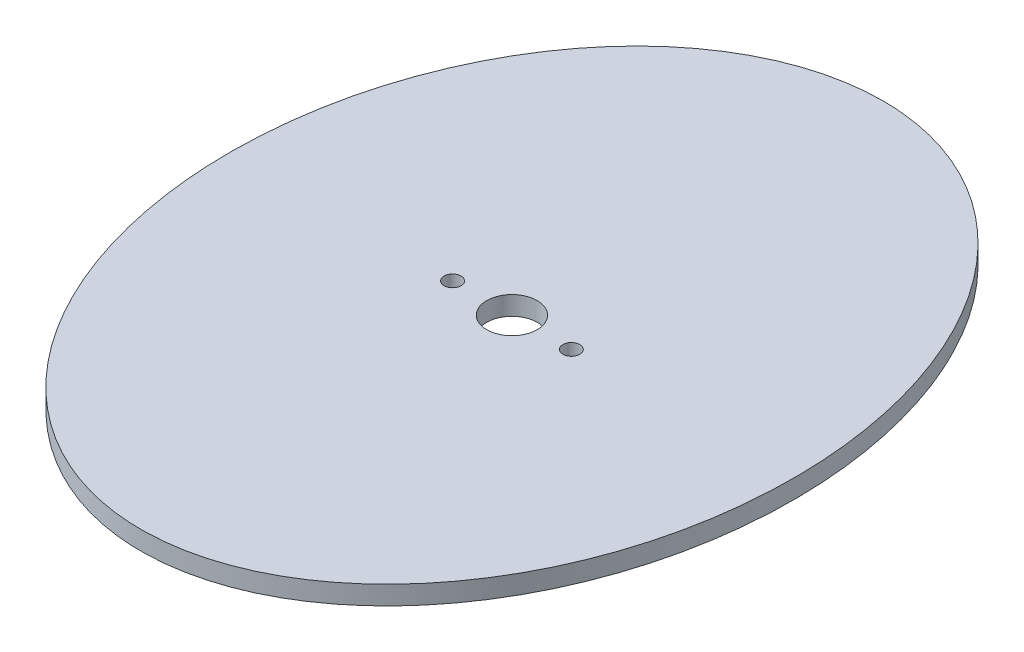
ISO-10303-21;
HEADER;
FILE_DESCRIPTION(('STEP AP214'),'2;1');
FILE_NAME('part.step','',(''),(''),'','','');
FILE_SCHEMA(('AUTOMOTIVE_DESIGN { 1 0 10303 214 1 1 1 1 }'));
ENDSEC;
DATA;
#1=APPLICATION_CONTEXT('core data for automotive mechanical design processes');
#2=APPLICATION_PROTOCOL_DEFINITION('international standard','automotive_design',2000,#1);
#3=PRODUCT_CONTEXT('',#1,'mechanical');
#4=PRODUCT('Part','Part','',(#3));
#5=PRODUCT_RELATED_PRODUCT_CATEGORY('part','',(#4));
#6=PRODUCT_DEFINITION_FORMATION('','',#4);
#7=PRODUCT_DEFINITION_CONTEXT('part definition',#1,'design');
#8=PRODUCT_DEFINITION('design','',#6,#7);
#9=PRODUCT_DEFINITION_SHAPE('','',#8);
#10=(LENGTH_UNIT() NAMED_UNIT(*) SI_UNIT(.MILLI.,.METRE.));
#11=(NAMED_UNIT(*) PLANE_ANGLE_UNIT() SI_UNIT($,.RADIAN.));
#12=(NAMED_UNIT(*) SI_UNIT($,.STERADIAN.) SOLID_ANGLE_UNIT());
#13=UNCERTAINTY_MEASURE_WITH_UNIT(LENGTH_MEASURE(1.E-05),#10,'distance_accuracy_value','');
#14=(GEOMETRIC_REPRESENTATION_CONTEXT(3) GLOBAL_UNCERTAINTY_ASSIGNED_CONTEXT((#13)) GLOBAL_UNIT_ASSIGNED_CONTEXT((#10,
#11,#12)) REPRESENTATION_CONTEXT('',''));
#15=CARTESIAN_POINT('',(0.,0.,0.));
#16=DIRECTION('',(0.,0.,1.));
#17=DIRECTION('',(1.,0.,0.));
#18=AXIS2_PLACEMENT_3D('',#15,#16,#17);
#19=CARTESIAN_POINT('',(0.,3.175,0.));
#20=DIRECTION('',(0.,1.,0.));
#21=DIRECTION('',(0.,0.,-1.));
#22=AXIS2_PLACEMENT_3D('',#19,#20,#21);
#23=ELLIPSE('',#22,62.5,47.5);
#24=DIRECTION('',(0.,-1.,0.));
#25=VECTOR('',#24,1.);
#26=SURFACE_OF_LINEAR_EXTRUSION('',#23,#25);
#27=CARTESIAN_POINT('',(0.,3.175,-62.5));
#28=VERTEX_POINT('',#27);
#29=EDGE_CURVE('E10',#28,#28,#23,.T.);
#30=ORIENTED_EDGE('',*,*,#29,.F.);
#31=EDGE_LOOP('',(#30));
#32=FACE_BOUND('',#31,.T.);
#33=CARTESIAN_POINT('',(0.,0.,0.));
#34=DIRECTION('',(0.,1.,0.));
#35=DIRECTION('',(0.,0.,-1.));
#36=AXIS2_PLACEMENT_3D('',#33,#34,#35);
#37=ELLIPSE('',#36,62.5,47.5);
#38=CARTESIAN_POINT('',(0.,0.,-62.5));
#39=VERTEX_POINT('',#38);
#40=EDGE_CURVE('E35',#39,#39,#37,.T.);
#41=ORIENTED_EDGE('',*,*,#40,.T.);
#42=EDGE_LOOP('',(#41));
#43=FACE_BOUND('',#42,.T.);
#44=ADVANCED_FACE('F31',(#32,#43),#26,.F.);
#45=CARTESIAN_POINT('',(0.,3.175,0.));
#46=DIRECTION('',(0.,1.,0.));
#47=DIRECTION('',(0.,0.,1.));
#48=AXIS2_PLACEMENT_3D('',#45,#46,#47);
#49=PLANE('',#48);
#50=CARTESIAN_POINT('',(10.,3.175,0.));
#51=DIRECTION('',(0.,1.,0.));
#52=DIRECTION('',(0.,0.,1.));
#53=AXIS2_PLACEMENT_3D('',#50,#51,#52);
#54=CIRCLE('',#53,1.425);
#55=CARTESIAN_POINT('',(10.,3.175,1.42499999999999));
#56=VERTEX_POINT('',#55);
#57=EDGE_CURVE('E50',#56,#56,#54,.T.);
#58=ORIENTED_EDGE('',*,*,#57,.F.);
#59=EDGE_LOOP('',(#58));
#60=FACE_BOUND('',#59,.T.);
#61=CARTESIAN_POINT('',(-10.,3.175,0.));
#62=DIRECTION('',(0.,1.,0.));
#63=DIRECTION('',(0.,0.,1.));
#64=AXIS2_PLACEMENT_3D('',#61,#62,#63);
#65=CIRCLE('',#64,1.425);
#66=CARTESIAN_POINT('',(-10.,3.175,1.425));
#67=VERTEX_POINT('',#66);
#68=EDGE_CURVE('E56',#67,#67,#65,.T.);
#69=ORIENTED_EDGE('',*,*,#68,.F.);
#70=EDGE_LOOP('',(#69));
#71=FACE_BOUND('',#70,.T.);
#72=CARTESIAN_POINT('',(0.,3.175,0.));
#73=DIRECTION('',(0.,1.,0.));
#74=DIRECTION('',(0.,0.,1.));
#75=AXIS2_PLACEMENT_3D('',#72,#73,#74);
#76=CIRCLE('',#75,4.25);
#77=CARTESIAN_POINT('',(0.,3.175,4.25));
#78=VERTEX_POINT('',#77);
#79=EDGE_CURVE('E44',#78,#78,#76,.T.);
#80=ORIENTED_EDGE('',*,*,#79,.F.);
#81=EDGE_LOOP('',(#80));
#82=FACE_BOUND('',#81,.T.);
#83=ORIENTED_EDGE('',*,*,#29,.T.);
#84=EDGE_LOOP('',(#83));
#85=FACE_BOUND('',#84,.T.);
#86=ADVANCED_FACE('F73',(#60,#71,#82,#85),#49,.T.);
#87=CARTESIAN_POINT('',(0.,0.,0.));
#88=DIRECTION('',(0.,1.,0.));
#89=DIRECTION('',(0.,0.,1.));
#90=AXIS2_PLACEMENT_3D('',#87,#88,#89);
#91=PLANE('',#90);
#92=CARTESIAN_POINT('',(10.,0.,0.));
#93=DIRECTION('',(0.,1.,0.));
#94=DIRECTION('',(0.,0.,1.));
#95=AXIS2_PLACEMENT_3D('',#92,#93,#94);
#96=CIRCLE('',#95,1.425);
#97=CARTESIAN_POINT('',(10.,0.,1.42499999999999));
#98=VERTEX_POINT('',#97);
#99=EDGE_CURVE('E53',#98,#98,#96,.T.);
#100=ORIENTED_EDGE('',*,*,#99,.T.);
#101=EDGE_LOOP('',(#100));
#102=FACE_BOUND('',#101,.T.);
#103=CARTESIAN_POINT('',(-10.,0.,0.));
#104=DIRECTION('',(0.,1.,0.));
#105=DIRECTION('',(0.,0.,1.));
#106=AXIS2_PLACEMENT_3D('',#103,#104,#105);
#107=CIRCLE('',#106,1.425);
#108=CARTESIAN_POINT('',(-10.,0.,1.425));
#109=VERTEX_POINT('',#108);
#110=EDGE_CURVE('E47',#109,#109,#107,.T.);
#111=ORIENTED_EDGE('',*,*,#110,.T.);
#112=EDGE_LOOP('',(#111));
#113=FACE_BOUND('',#112,.T.);
#114=CARTESIAN_POINT('',(0.,0.,0.));
#115=DIRECTION('',(0.,1.,0.));
#116=DIRECTION('',(0.,0.,1.));
#117=AXIS2_PLACEMENT_3D('',#114,#115,#116);
#118=CIRCLE('',#117,4.25);
#119=CARTESIAN_POINT('',(0.,0.,4.25));
#120=VERTEX_POINT('',#119);
#121=EDGE_CURVE('E41',#120,#120,#118,.T.);
#122=ORIENTED_EDGE('',*,*,#121,.T.);
#123=EDGE_LOOP('',(#122));
#124=FACE_BOUND('',#123,.T.);
#125=ORIENTED_EDGE('',*,*,#40,.F.);
#126=EDGE_LOOP('',(#125));
#127=FACE_BOUND('',#126,.T.);
#128=ADVANCED_FACE('F62',(#102,#113,#124,#127),#91,.F.);
#129=CARTESIAN_POINT('',(0.,0.,0.));
#130=DIRECTION('',(0.,1.,0.));
#131=DIRECTION('',(0.,0.,1.));
#132=AXIS2_PLACEMENT_3D('',#129,#130,#131);
#133=CYLINDRICAL_SURFACE('',#132,4.25);
#134=ORIENTED_EDGE('',*,*,#121,.F.);
#135=EDGE_LOOP('',(#134));
#136=FACE_BOUND('',#135,.T.);
#137=ORIENTED_EDGE('',*,*,#79,.T.);
#138=EDGE_LOOP('',(#137));
#139=FACE_BOUND('',#138,.T.);
#140=ADVANCED_FACE('F69',(#136,#139),#133,.F.);
#141=CARTESIAN_POINT('',(-10.,0.,0.));
#142=DIRECTION('',(0.,1.,0.));
#143=DIRECTION('',(0.,0.,1.));
#144=AXIS2_PLACEMENT_3D('',#141,#142,#143);
#145=CYLINDRICAL_SURFACE('',#144,1.425);
#146=ORIENTED_EDGE('',*,*,#110,.F.);
#147=EDGE_LOOP('',(#146));
#148=FACE_BOUND('',#147,.T.);
#149=ORIENTED_EDGE('',*,*,#68,.T.);
#150=EDGE_LOOP('',(#149));
#151=FACE_BOUND('',#150,.T.);
#152=ADVANCED_FACE('F65',(#148,#151),#145,.F.);
#153=CARTESIAN_POINT('',(10.,0.,0.));
#154=DIRECTION('',(0.,1.,0.));
#155=DIRECTION('',(0.,0.,1.));
#156=AXIS2_PLACEMENT_3D('',#153,#154,#155);
#157=CYLINDRICAL_SURFACE('',#156,1.425);
#158=ORIENTED_EDGE('',*,*,#99,.F.);
#159=EDGE_LOOP('',(#158));
#160=FACE_BOUND('',#159,.T.);
#161=ORIENTED_EDGE('',*,*,#57,.T.);
#162=EDGE_LOOP('',(#161));
#163=FACE_BOUND('',#162,.T.);
#164=ADVANCED_FACE('F68',(#160,#163),#157,.F.);
#165=CLOSED_SHELL('',(#44,#86,#128,#140,#152,#164));
#166=MANIFOLD_SOLID_BREP('B2',#165);
#167=ADVANCED_BREP_SHAPE_REPRESENTATION('',(#18,#166),#14);
#168=SHAPE_DEFINITION_REPRESENTATION(#9,#167);
ENDSEC;
END-ISO-10303-21;
